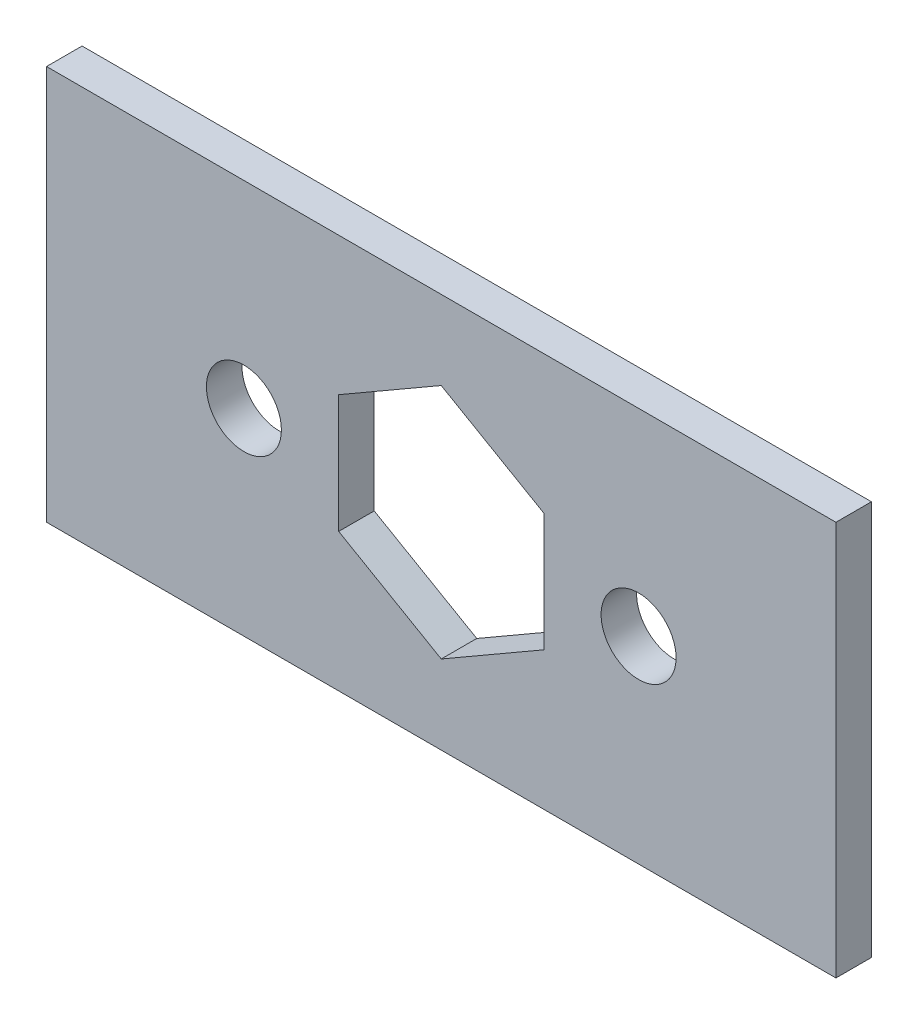
ISO-10303-21;
HEADER;
FILE_DESCRIPTION(('STEP AP214'),'2;1');
FILE_NAME('part.step','',(''),(''),'','','');
FILE_SCHEMA(('AUTOMOTIVE_DESIGN { 1 0 10303 214 1 1 1 1 }'));
ENDSEC;
DATA;
#1=APPLICATION_CONTEXT('core data for automotive mechanical design processes');
#2=APPLICATION_PROTOCOL_DEFINITION('international standard','automotive_design',2000,#1);
#3=PRODUCT_CONTEXT('',#1,'mechanical');
#4=PRODUCT('Part','Part','',(#3));
#5=PRODUCT_RELATED_PRODUCT_CATEGORY('part','',(#4));
#6=PRODUCT_DEFINITION_FORMATION('','',#4);
#7=PRODUCT_DEFINITION_CONTEXT('part definition',#1,'design');
#8=PRODUCT_DEFINITION('design','',#6,#7);
#9=PRODUCT_DEFINITION_SHAPE('','',#8);
#10=(LENGTH_UNIT() NAMED_UNIT(*) SI_UNIT(.MILLI.,.METRE.));
#11=(NAMED_UNIT(*) PLANE_ANGLE_UNIT() SI_UNIT($,.RADIAN.));
#12=(NAMED_UNIT(*) SI_UNIT($,.STERADIAN.) SOLID_ANGLE_UNIT());
#13=UNCERTAINTY_MEASURE_WITH_UNIT(LENGTH_MEASURE(1.E-05),#10,'distance_accuracy_value','');
#14=(GEOMETRIC_REPRESENTATION_CONTEXT(3) GLOBAL_UNCERTAINTY_ASSIGNED_CONTEXT((#13)) GLOBAL_UNIT_ASSIGNED_CONTEXT((#10,
#11,#12)) REPRESENTATION_CONTEXT('',''));
#15=CARTESIAN_POINT('',(0.,0.,0.));
#16=DIRECTION('',(0.,0.,1.));
#17=DIRECTION('',(1.,0.,0.));
#18=AXIS2_PLACEMENT_3D('',#15,#16,#17);
#19=CARTESIAN_POINT('',(0.,0.,1.143));
#20=DIRECTION('',(0.,0.,-1.));
#21=DIRECTION('',(-1.,0.,0.));
#22=AXIS2_PLACEMENT_3D('',#19,#20,#21);
#23=PLANE('',#22);
#24=CARTESIAN_POINT('',(12.7,0.,1.143));
#25=DIRECTION('',(0.,0.,1.));
#26=DIRECTION('',(1.,0.,0.));
#27=AXIS2_PLACEMENT_3D('',#24,#25,#26);
#28=CIRCLE('',#27,2.413);
#29=CARTESIAN_POINT('',(15.113,0.,1.143));
#30=VERTEX_POINT('',#29);
#31=EDGE_CURVE('E163',#30,#30,#28,.T.);
#32=ORIENTED_EDGE('',*,*,#31,.F.);
#33=EDGE_LOOP('',(#32));
#34=FACE_BOUND('',#33,.T.);
#35=DIRECTION('',(0.,1.,0.));
#36=VECTOR('',#35,1.);
#37=CARTESIAN_POINT('',(25.4,12.7,1.143));
#38=LINE('',#37,#36);
#39=CARTESIAN_POINT('',(25.4,-12.7,1.143));
#40=VERTEX_POINT('',#39);
#41=CARTESIAN_POINT('',(25.4,12.7,1.143));
#42=VERTEX_POINT('',#41);
#43=EDGE_CURVE('E175',#40,#42,#38,.T.);
#44=ORIENTED_EDGE('',*,*,#43,.T.);
#45=DIRECTION('',(-1.,0.,0.));
#46=VECTOR('',#45,1.);
#47=CARTESIAN_POINT('',(25.4,12.7,1.143));
#48=LINE('',#47,#46);
#49=CARTESIAN_POINT('',(-25.4,12.7,1.143));
#50=VERTEX_POINT('',#49);
#51=EDGE_CURVE('E178',#42,#50,#48,.T.);
#52=ORIENTED_EDGE('',*,*,#51,.T.);
#53=DIRECTION('',(0.,-1.,0.));
#54=VECTOR('',#53,1.);
#55=CARTESIAN_POINT('',(-25.4,12.7,1.143));
#56=LINE('',#55,#54);
#57=CARTESIAN_POINT('',(-25.4,-12.7,1.143));
#58=VERTEX_POINT('',#57);
#59=EDGE_CURVE('E181',#50,#58,#56,.T.);
#60=ORIENTED_EDGE('',*,*,#59,.T.);
#61=DIRECTION('',(1.,0.,0.));
#62=VECTOR('',#61,1.);
#63=CARTESIAN_POINT('',(25.4,-12.7,1.143));
#64=LINE('',#63,#62);
#65=EDGE_CURVE('E183',#58,#40,#64,.T.);
#66=ORIENTED_EDGE('',*,*,#65,.T.);
#67=EDGE_LOOP('',(#44,#52,#60,#66));
#68=FACE_BOUND('',#67,.T.);
#69=CARTESIAN_POINT('',(-12.7,0.,1.143));
#70=DIRECTION('',(0.,0.,1.));
#71=DIRECTION('',(1.,0.,0.));
#72=AXIS2_PLACEMENT_3D('',#69,#70,#71);
#73=CIRCLE('',#72,2.413);
#74=CARTESIAN_POINT('',(-10.287,0.,1.143));
#75=VERTEX_POINT('',#74);
#76=EDGE_CURVE('E169',#75,#75,#73,.T.);
#77=ORIENTED_EDGE('',*,*,#76,.F.);
#78=EDGE_LOOP('',(#77));
#79=FACE_BOUND('',#78,.T.);
#80=DIRECTION('',(-0.866025403784439,0.5,0.));
#81=VECTOR('',#80,1.);
#82=CARTESIAN_POINT('',(6.59911357683742,3.81,1.143));
#83=LINE('',#82,#81);
#84=CARTESIAN_POINT('',(6.59911357683742,3.81,1.143));
#85=VERTEX_POINT('',#84);
#86=CARTESIAN_POINT('',(0.,7.62,1.143));
#87=VERTEX_POINT('',#86);
#88=EDGE_CURVE('E112',#85,#87,#83,.T.);
#89=ORIENTED_EDGE('',*,*,#88,.F.);
#90=DIRECTION('',(0.,1.,0.));
#91=VECTOR('',#90,1.);
#92=CARTESIAN_POINT('',(6.59911357683742,-3.81,1.143));
#93=LINE('',#92,#91);
#94=CARTESIAN_POINT('',(6.59911357683742,-3.81,1.143));
#95=VERTEX_POINT('',#94);
#96=EDGE_CURVE('E141',#95,#85,#93,.T.);
#97=ORIENTED_EDGE('',*,*,#96,.F.);
#98=DIRECTION('',(0.866025403784439,0.5,0.));
#99=VECTOR('',#98,1.);
#100=CARTESIAN_POINT('',(0.,-7.62,1.143));
#101=LINE('',#100,#99);
#102=CARTESIAN_POINT('',(0.,-7.62,1.143));
#103=VERTEX_POINT('',#102);
#104=EDGE_CURVE('E139',#103,#95,#101,.T.);
#105=ORIENTED_EDGE('',*,*,#104,.F.);
#106=DIRECTION('',(0.866025403784439,-0.5,0.));
#107=VECTOR('',#106,1.);
#108=CARTESIAN_POINT('',(-6.59911357683742,-3.81,1.143));
#109=LINE('',#108,#107);
#110=CARTESIAN_POINT('',(-6.59911357683742,-3.81,1.143));
#111=VERTEX_POINT('',#110);
#112=EDGE_CURVE('E135',#111,#103,#109,.T.);
#113=ORIENTED_EDGE('',*,*,#112,.F.);
#114=DIRECTION('',(0.,-1.,0.));
#115=VECTOR('',#114,1.);
#116=CARTESIAN_POINT('',(-6.59911357683742,3.81,1.143));
#117=LINE('',#116,#115);
#118=CARTESIAN_POINT('',(-6.59911357683742,3.81,1.143));
#119=VERTEX_POINT('',#118);
#120=EDGE_CURVE('E133',#119,#111,#117,.T.);
#121=ORIENTED_EDGE('',*,*,#120,.F.);
#122=DIRECTION('',(-0.866025403784439,-0.5,0.));
#123=VECTOR('',#122,1.);
#124=CARTESIAN_POINT('',(0.,7.62,1.143));
#125=LINE('',#124,#123);
#126=EDGE_CURVE('E120',#87,#119,#125,.T.);
#127=ORIENTED_EDGE('',*,*,#126,.F.);
#128=EDGE_LOOP('',(#89,#97,#105,#113,#121,#127));
#129=FACE_BOUND('',#128,.T.);
#130=ADVANCED_FACE('F35',(#34,#68,#79,#129),#23,.F.);
#131=CARTESIAN_POINT('',(0.,0.,-1.143));
#132=DIRECTION('',(0.,0.,-1.));
#133=DIRECTION('',(-1.,0.,0.));
#134=AXIS2_PLACEMENT_3D('',#131,#132,#133);
#135=PLANE('',#134);
#136=CARTESIAN_POINT('',(12.7,0.,-1.143));
#137=DIRECTION('',(0.,0.,1.));
#138=DIRECTION('',(1.,0.,0.));
#139=AXIS2_PLACEMENT_3D('',#136,#137,#138);
#140=CIRCLE('',#139,2.413);
#141=CARTESIAN_POINT('',(15.113,0.,-1.143));
#142=VERTEX_POINT('',#141);
#143=EDGE_CURVE('E128',#142,#142,#140,.T.);
#144=ORIENTED_EDGE('',*,*,#143,.T.);
#145=EDGE_LOOP('',(#144));
#146=FACE_BOUND('',#145,.T.);
#147=DIRECTION('',(0.,1.,0.));
#148=VECTOR('',#147,1.);
#149=CARTESIAN_POINT('',(25.4,12.7,-1.143));
#150=LINE('',#149,#148);
#151=CARTESIAN_POINT('',(25.4,-12.7,-1.143));
#152=VERTEX_POINT('',#151);
#153=CARTESIAN_POINT('',(25.4,12.7,-1.143));
#154=VERTEX_POINT('',#153);
#155=EDGE_CURVE('E172',#152,#154,#150,.T.);
#156=ORIENTED_EDGE('',*,*,#155,.F.);
#157=DIRECTION('',(1.,0.,0.));
#158=VECTOR('',#157,1.);
#159=CARTESIAN_POINT('',(25.4,-12.7,-1.143));
#160=LINE('',#159,#158);
#161=CARTESIAN_POINT('',(-25.4,-12.7,-1.143));
#162=VERTEX_POINT('',#161);
#163=EDGE_CURVE('E179',#162,#152,#160,.T.);
#164=ORIENTED_EDGE('',*,*,#163,.F.);
#165=DIRECTION('',(0.,-1.,0.));
#166=VECTOR('',#165,1.);
#167=CARTESIAN_POINT('',(-25.4,12.7,-1.143));
#168=LINE('',#167,#166);
#169=CARTESIAN_POINT('',(-25.4,12.7,-1.143));
#170=VERTEX_POINT('',#169);
#171=EDGE_CURVE('E190',#170,#162,#168,.T.);
#172=ORIENTED_EDGE('',*,*,#171,.F.);
#173=DIRECTION('',(-1.,0.,0.));
#174=VECTOR('',#173,1.);
#175=CARTESIAN_POINT('',(25.4,12.7,-1.143));
#176=LINE('',#175,#174);
#177=EDGE_CURVE('E188',#154,#170,#176,.T.);
#178=ORIENTED_EDGE('',*,*,#177,.F.);
#179=EDGE_LOOP('',(#156,#164,#172,#178));
#180=FACE_BOUND('',#179,.T.);
#181=CARTESIAN_POINT('',(-12.7,0.,-1.143));
#182=DIRECTION('',(0.,0.,1.));
#183=DIRECTION('',(1.,0.,0.));
#184=AXIS2_PLACEMENT_3D('',#181,#182,#183);
#185=CIRCLE('',#184,2.413);
#186=CARTESIAN_POINT('',(-10.287,0.,-1.143));
#187=VERTEX_POINT('',#186);
#188=EDGE_CURVE('E166',#187,#187,#185,.T.);
#189=ORIENTED_EDGE('',*,*,#188,.T.);
#190=EDGE_LOOP('',(#189));
#191=FACE_BOUND('',#190,.T.);
#192=DIRECTION('',(0.,1.,0.));
#193=VECTOR('',#192,1.);
#194=CARTESIAN_POINT('',(6.59911357683742,-3.81,-1.143));
#195=LINE('',#194,#193);
#196=CARTESIAN_POINT('',(6.59911357683742,-3.81,-1.143));
#197=VERTEX_POINT('',#196);
#198=CARTESIAN_POINT('',(6.59911357683742,3.81,-1.143));
#199=VERTEX_POINT('',#198);
#200=EDGE_CURVE('E121',#197,#199,#195,.T.);
#201=ORIENTED_EDGE('',*,*,#200,.T.);
#202=DIRECTION('',(-0.866025403784439,0.5,0.));
#203=VECTOR('',#202,1.);
#204=CARTESIAN_POINT('',(6.59911357683742,3.81,-1.143));
#205=LINE('',#204,#203);
#206=CARTESIAN_POINT('',(0.,7.62,-1.143));
#207=VERTEX_POINT('',#206);
#208=EDGE_CURVE('E58',#199,#207,#205,.T.);
#209=ORIENTED_EDGE('',*,*,#208,.T.);
#210=DIRECTION('',(-0.866025403784439,-0.5,0.));
#211=VECTOR('',#210,1.);
#212=CARTESIAN_POINT('',(0.,7.62,-1.143));
#213=LINE('',#212,#211);
#214=CARTESIAN_POINT('',(-6.59911357683742,3.81,-1.143));
#215=VERTEX_POINT('',#214);
#216=EDGE_CURVE('E127',#207,#215,#213,.T.);
#217=ORIENTED_EDGE('',*,*,#216,.T.);
#218=DIRECTION('',(0.,-1.,0.));
#219=VECTOR('',#218,1.);
#220=CARTESIAN_POINT('',(-6.59911357683742,3.81,-1.143));
#221=LINE('',#220,#219);
#222=CARTESIAN_POINT('',(-6.59911357683742,-3.81,-1.143));
#223=VERTEX_POINT('',#222);
#224=EDGE_CURVE('E145',#215,#223,#221,.T.);
#225=ORIENTED_EDGE('',*,*,#224,.T.);
#226=DIRECTION('',(0.866025403784439,-0.5,0.));
#227=VECTOR('',#226,1.);
#228=CARTESIAN_POINT('',(-6.59911357683742,-3.81,-1.143));
#229=LINE('',#228,#227);
#230=CARTESIAN_POINT('',(0.,-7.62,-1.143));
#231=VERTEX_POINT('',#230);
#232=EDGE_CURVE('E148',#223,#231,#229,.T.);
#233=ORIENTED_EDGE('',*,*,#232,.T.);
#234=DIRECTION('',(0.866025403784439,0.5,0.));
#235=VECTOR('',#234,1.);
#236=CARTESIAN_POINT('',(0.,-7.62,-1.143));
#237=LINE('',#236,#235);
#238=EDGE_CURVE('E151',#231,#197,#237,.T.);
#239=ORIENTED_EDGE('',*,*,#238,.T.);
#240=EDGE_LOOP('',(#201,#209,#217,#225,#233,#239));
#241=FACE_BOUND('',#240,.T.);
#242=ADVANCED_FACE('F208',(#146,#180,#191,#241),#135,.T.);
#243=CARTESIAN_POINT('',(25.4,12.7,1.143));
#244=DIRECTION('',(-1.,0.,0.));
#245=DIRECTION('',(0.,0.,1.));
#246=AXIS2_PLACEMENT_3D('',#243,#244,#245);
#247=PLANE('',#246);
#248=ORIENTED_EDGE('',*,*,#155,.T.);
#249=DIRECTION('',(0.,0.,-1.));
#250=VECTOR('',#249,1.);
#251=CARTESIAN_POINT('',(25.4,12.7,1.143));
#252=LINE('',#251,#250);
#253=EDGE_CURVE('E11',#42,#154,#252,.T.);
#254=ORIENTED_EDGE('',*,*,#253,.F.);
#255=ORIENTED_EDGE('',*,*,#43,.F.);
#256=DIRECTION('',(0.,0.,-1.));
#257=VECTOR('',#256,1.);
#258=CARTESIAN_POINT('',(25.4,-12.7,1.143));
#259=LINE('',#258,#257);
#260=EDGE_CURVE('E185',#40,#152,#259,.T.);
#261=ORIENTED_EDGE('',*,*,#260,.T.);
#262=EDGE_LOOP('',(#248,#254,#255,#261));
#263=FACE_BOUND('',#262,.T.);
#264=ADVANCED_FACE('F37',(#263),#247,.F.);
#265=CARTESIAN_POINT('',(25.4,12.7,1.143));
#266=DIRECTION('',(0.,-1.,0.));
#267=DIRECTION('',(1.,0.,0.));
#268=AXIS2_PLACEMENT_3D('',#265,#266,#267);
#269=PLANE('',#268);
#270=ORIENTED_EDGE('',*,*,#177,.T.);
#271=DIRECTION('',(0.,0.,-1.));
#272=VECTOR('',#271,1.);
#273=CARTESIAN_POINT('',(-25.4,12.7,1.143));
#274=LINE('',#273,#272);
#275=EDGE_CURVE('E43',#50,#170,#274,.T.);
#276=ORIENTED_EDGE('',*,*,#275,.F.);
#277=ORIENTED_EDGE('',*,*,#51,.F.);
#278=ORIENTED_EDGE('',*,*,#253,.T.);
#279=EDGE_LOOP('',(#270,#276,#277,#278));
#280=FACE_BOUND('',#279,.T.);
#281=ADVANCED_FACE('F219',(#280),#269,.F.);
#282=CARTESIAN_POINT('',(-25.4,12.7,1.143));
#283=DIRECTION('',(1.,0.,0.));
#284=DIRECTION('',(0.,0.,-1.));
#285=AXIS2_PLACEMENT_3D('',#282,#283,#284);
#286=PLANE('',#285);
#287=ORIENTED_EDGE('',*,*,#171,.T.);
#288=DIRECTION('',(0.,0.,-1.));
#289=VECTOR('',#288,1.);
#290=CARTESIAN_POINT('',(-25.4,-12.7,1.143));
#291=LINE('',#290,#289);
#292=EDGE_CURVE('E195',#58,#162,#291,.T.);
#293=ORIENTED_EDGE('',*,*,#292,.F.);
#294=ORIENTED_EDGE('',*,*,#59,.F.);
#295=ORIENTED_EDGE('',*,*,#275,.T.);
#296=EDGE_LOOP('',(#287,#293,#294,#295));
#297=FACE_BOUND('',#296,.T.);
#298=ADVANCED_FACE('F202',(#297),#286,.F.);
#299=CARTESIAN_POINT('',(25.4,-12.7,1.143));
#300=DIRECTION('',(0.,1.,0.));
#301=DIRECTION('',(-1.,0.,0.));
#302=AXIS2_PLACEMENT_3D('',#299,#300,#301);
#303=PLANE('',#302);
#304=ORIENTED_EDGE('',*,*,#163,.T.);
#305=ORIENTED_EDGE('',*,*,#260,.F.);
#306=ORIENTED_EDGE('',*,*,#65,.F.);
#307=ORIENTED_EDGE('',*,*,#292,.T.);
#308=EDGE_LOOP('',(#304,#305,#306,#307));
#309=FACE_BOUND('',#308,.T.);
#310=ADVANCED_FACE('F212',(#309),#303,.F.);
#311=CARTESIAN_POINT('',(-12.7,0.,1.143));
#312=DIRECTION('',(0.,0.,-1.));
#313=DIRECTION('',(-1.,0.,0.));
#314=AXIS2_PLACEMENT_3D('',#311,#312,#313);
#315=CYLINDRICAL_SURFACE('',#314,2.413);
#316=ORIENTED_EDGE('',*,*,#76,.T.);
#317=EDGE_LOOP('',(#316));
#318=FACE_BOUND('',#317,.T.);
#319=ORIENTED_EDGE('',*,*,#188,.F.);
#320=EDGE_LOOP('',(#319));
#321=FACE_BOUND('',#320,.T.);
#322=ADVANCED_FACE('F236',(#318,#321),#315,.F.);
#323=CARTESIAN_POINT('',(12.7,0.,1.143));
#324=DIRECTION('',(0.,0.,-1.));
#325=DIRECTION('',(-1.,0.,0.));
#326=AXIS2_PLACEMENT_3D('',#323,#324,#325);
#327=CYLINDRICAL_SURFACE('',#326,2.413);
#328=ORIENTED_EDGE('',*,*,#31,.T.);
#329=EDGE_LOOP('',(#328));
#330=FACE_BOUND('',#329,.T.);
#331=ORIENTED_EDGE('',*,*,#143,.F.);
#332=EDGE_LOOP('',(#331));
#333=FACE_BOUND('',#332,.T.);
#334=ADVANCED_FACE('F243',(#330,#333),#327,.F.);
#335=CARTESIAN_POINT('',(6.59911357683742,3.81,1.143));
#336=DIRECTION('',(-0.5,-0.866025403784439,0.));
#337=DIRECTION('',(0.866025403784439,-0.5,0.));
#338=AXIS2_PLACEMENT_3D('',#335,#336,#337);
#339=PLANE('',#338);
#340=ORIENTED_EDGE('',*,*,#208,.F.);
#341=DIRECTION('',(0.,0.,-1.));
#342=VECTOR('',#341,1.);
#343=CARTESIAN_POINT('',(6.59911357683742,3.81,1.143));
#344=LINE('',#343,#342);
#345=EDGE_CURVE('E116',#85,#199,#344,.T.);
#346=ORIENTED_EDGE('',*,*,#345,.F.);
#347=ORIENTED_EDGE('',*,*,#88,.T.);
#348=DIRECTION('',(0.,0.,-1.));
#349=VECTOR('',#348,1.);
#350=CARTESIAN_POINT('',(0.,7.62,1.143));
#351=LINE('',#350,#349);
#352=EDGE_CURVE('E115',#87,#207,#351,.T.);
#353=ORIENTED_EDGE('',*,*,#352,.T.);
#354=EDGE_LOOP('',(#340,#346,#347,#353));
#355=FACE_BOUND('',#354,.T.);
#356=ADVANCED_FACE('F114',(#355),#339,.T.);
#357=CARTESIAN_POINT('',(0.,7.62,1.143));
#358=DIRECTION('',(0.5,-0.866025403784439,0.));
#359=DIRECTION('',(0.866025403784439,0.5,0.));
#360=AXIS2_PLACEMENT_3D('',#357,#358,#359);
#361=PLANE('',#360);
#362=ORIENTED_EDGE('',*,*,#216,.F.);
#363=ORIENTED_EDGE('',*,*,#352,.F.);
#364=ORIENTED_EDGE('',*,*,#126,.T.);
#365=DIRECTION('',(0.,0.,-1.));
#366=VECTOR('',#365,1.);
#367=CARTESIAN_POINT('',(-6.59911357683742,3.81,1.143));
#368=LINE('',#367,#366);
#369=EDGE_CURVE('E129',#119,#215,#368,.T.);
#370=ORIENTED_EDGE('',*,*,#369,.T.);
#371=EDGE_LOOP('',(#362,#363,#364,#370));
#372=FACE_BOUND('',#371,.T.);
#373=ADVANCED_FACE('F124',(#372),#361,.T.);
#374=CARTESIAN_POINT('',(-6.59911357683742,3.81,1.143));
#375=DIRECTION('',(1.,0.,0.));
#376=DIRECTION('',(0.,1.,0.));
#377=AXIS2_PLACEMENT_3D('',#374,#375,#376);
#378=PLANE('',#377);
#379=ORIENTED_EDGE('',*,*,#224,.F.);
#380=ORIENTED_EDGE('',*,*,#369,.F.);
#381=ORIENTED_EDGE('',*,*,#120,.T.);
#382=DIRECTION('',(0.,0.,-1.));
#383=VECTOR('',#382,1.);
#384=CARTESIAN_POINT('',(-6.59911357683742,-3.81,1.143));
#385=LINE('',#384,#383);
#386=EDGE_CURVE('E160',#111,#223,#385,.T.);
#387=ORIENTED_EDGE('',*,*,#386,.T.);
#388=EDGE_LOOP('',(#379,#380,#381,#387));
#389=FACE_BOUND('',#388,.T.);
#390=ADVANCED_FACE('F265',(#389),#378,.T.);
#391=CARTESIAN_POINT('',(-6.59911357683742,-3.81,1.143));
#392=DIRECTION('',(0.5,0.866025403784438,0.));
#393=DIRECTION('',(-0.866025403784439,0.5,0.));
#394=AXIS2_PLACEMENT_3D('',#391,#392,#393);
#395=PLANE('',#394);
#396=ORIENTED_EDGE('',*,*,#232,.F.);
#397=ORIENTED_EDGE('',*,*,#386,.F.);
#398=ORIENTED_EDGE('',*,*,#112,.T.);
#399=DIRECTION('',(0.,0.,-1.));
#400=VECTOR('',#399,1.);
#401=CARTESIAN_POINT('',(0.,-7.62,1.143));
#402=LINE('',#401,#400);
#403=EDGE_CURVE('E158',#103,#231,#402,.T.);
#404=ORIENTED_EDGE('',*,*,#403,.T.);
#405=EDGE_LOOP('',(#396,#397,#398,#404));
#406=FACE_BOUND('',#405,.T.);
#407=ADVANCED_FACE('F261',(#406),#395,.T.);
#408=CARTESIAN_POINT('',(0.,-7.62,1.143));
#409=DIRECTION('',(-0.5,0.866025403784439,0.));
#410=DIRECTION('',(-0.866025403784439,-0.5,0.));
#411=AXIS2_PLACEMENT_3D('',#408,#409,#410);
#412=PLANE('',#411);
#413=ORIENTED_EDGE('',*,*,#238,.F.);
#414=ORIENTED_EDGE('',*,*,#403,.F.);
#415=ORIENTED_EDGE('',*,*,#104,.T.);
#416=DIRECTION('',(0.,0.,-1.));
#417=VECTOR('',#416,1.);
#418=CARTESIAN_POINT('',(6.59911357683742,-3.81,1.143));
#419=LINE('',#418,#417);
#420=EDGE_CURVE('E50',#95,#197,#419,.T.);
#421=ORIENTED_EDGE('',*,*,#420,.T.);
#422=EDGE_LOOP('',(#413,#414,#415,#421));
#423=FACE_BOUND('',#422,.T.);
#424=ADVANCED_FACE('F258',(#423),#412,.T.);
#425=CARTESIAN_POINT('',(6.59911357683742,-3.81,1.143));
#426=DIRECTION('',(-1.,0.,0.));
#427=DIRECTION('',(0.,-1.,0.));
#428=AXIS2_PLACEMENT_3D('',#425,#426,#427);
#429=PLANE('',#428);
#430=ORIENTED_EDGE('',*,*,#200,.F.);
#431=ORIENTED_EDGE('',*,*,#420,.F.);
#432=ORIENTED_EDGE('',*,*,#96,.T.);
#433=ORIENTED_EDGE('',*,*,#345,.T.);
#434=EDGE_LOOP('',(#430,#431,#432,#433));
#435=FACE_BOUND('',#434,.T.);
#436=ADVANCED_FACE('F254',(#435),#429,.T.);
#437=CLOSED_SHELL('',(#130,#242,#264,#281,#298,#310,#322,#334,#356,#373,#390,#407,#424,#436));
#438=MANIFOLD_SOLID_BREP('B2',#437);
#439=ADVANCED_BREP_SHAPE_REPRESENTATION('',(#18,#438),#14);
#440=SHAPE_DEFINITION_REPRESENTATION(#9,#439);
ENDSEC;
END-ISO-10303-21;
